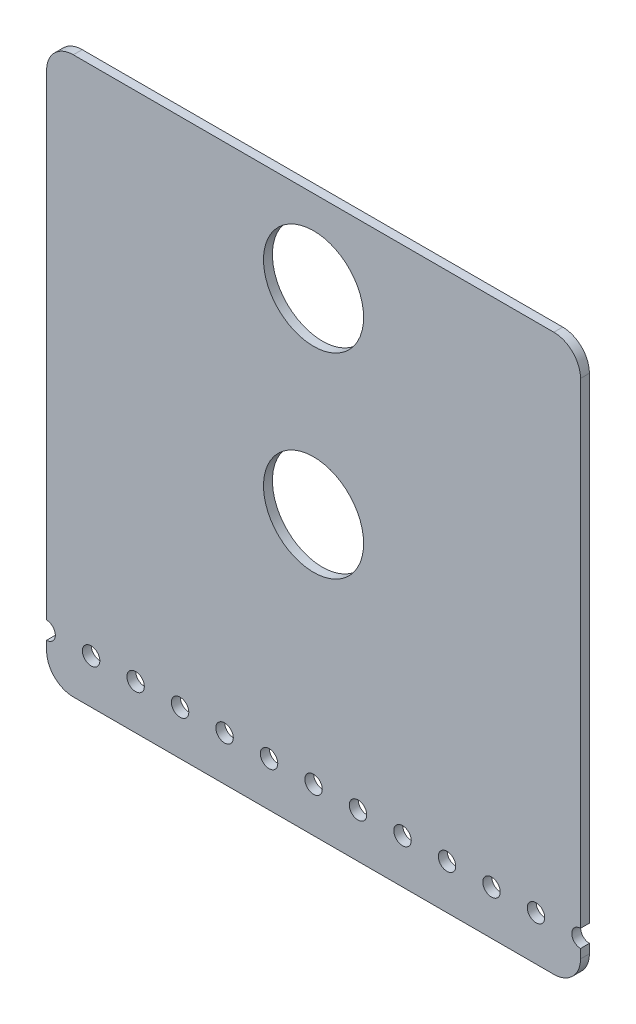
ISO-10303-21;
HEADER;
FILE_DESCRIPTION(('STEP AP214'),'2;1');
FILE_NAME('part.step','',(''),(''),'','','');
FILE_SCHEMA(('AUTOMOTIVE_DESIGN { 1 0 10303 214 1 1 1 1 }'));
ENDSEC;
DATA;
#1=APPLICATION_CONTEXT('core data for automotive mechanical design processes');
#2=APPLICATION_PROTOCOL_DEFINITION('international standard','automotive_design',2000,#1);
#3=PRODUCT_CONTEXT('',#1,'mechanical');
#4=PRODUCT('Part','Part','',(#3));
#5=PRODUCT_RELATED_PRODUCT_CATEGORY('part','',(#4));
#6=PRODUCT_DEFINITION_FORMATION('','',#4);
#7=PRODUCT_DEFINITION_CONTEXT('part definition',#1,'design');
#8=PRODUCT_DEFINITION('design','',#6,#7);
#9=PRODUCT_DEFINITION_SHAPE('','',#8);
#10=(LENGTH_UNIT() NAMED_UNIT(*) SI_UNIT(.MILLI.,.METRE.));
#11=(NAMED_UNIT(*) PLANE_ANGLE_UNIT() SI_UNIT($,.RADIAN.));
#12=(NAMED_UNIT(*) SI_UNIT($,.STERADIAN.) SOLID_ANGLE_UNIT());
#13=UNCERTAINTY_MEASURE_WITH_UNIT(LENGTH_MEASURE(1.E-05),#10,'distance_accuracy_value','');
#14=(GEOMETRIC_REPRESENTATION_CONTEXT(3) GLOBAL_UNCERTAINTY_ASSIGNED_CONTEXT((#13)) GLOBAL_UNIT_ASSIGNED_CONTEXT((#10,
#11,#12)) REPRESENTATION_CONTEXT('',''));
#15=CARTESIAN_POINT('',(0.,0.,0.));
#16=DIRECTION('',(0.,0.,1.));
#17=DIRECTION('',(1.,0.,0.));
#18=AXIS2_PLACEMENT_3D('',#15,#16,#17);
#19=CARTESIAN_POINT('',(76.1999999999999,0.,2.54));
#20=DIRECTION('',(1.,0.,0.));
#21=DIRECTION('',(0.,0.,-1.));
#22=AXIS2_PLACEMENT_3D('',#19,#20,#21);
#23=PLANE('',#22);
#24=DIRECTION('',(0.,-1.,0.));
#25=VECTOR('',#24,1.);
#26=CARTESIAN_POINT('',(76.1999999999999,0.,0.));
#27=LINE('',#26,#25);
#28=CARTESIAN_POINT('',(76.1999999999999,125.73,0.));
#29=VERTEX_POINT('',#28);
#30=CARTESIAN_POINT('',(76.1999999999999,-10.2107999999998,0.));
#31=VERTEX_POINT('',#30);
#32=EDGE_CURVE('E199',#29,#31,#27,.T.);
#33=ORIENTED_EDGE('',*,*,#32,.F.);
#34=DIRECTION('',(0.,0.,-1.));
#35=VECTOR('',#34,1.);
#36=CARTESIAN_POINT('',(76.1999999999999,125.73,2.54));
#37=LINE('',#36,#35);
#38=CARTESIAN_POINT('',(76.1999999999999,125.73,2.54));
#39=VERTEX_POINT('',#38);
#40=EDGE_CURVE('E43',#29,#39,#37,.F.);
#41=ORIENTED_EDGE('',*,*,#40,.T.);
#42=DIRECTION('',(0.,-1.,0.));
#43=VECTOR('',#42,1.);
#44=CARTESIAN_POINT('',(76.1999999999999,0.,2.54));
#45=LINE('',#44,#43);
#46=CARTESIAN_POINT('',(76.1999999999999,-10.2107999999998,2.54));
#47=VERTEX_POINT('',#46);
#48=EDGE_CURVE('E288',#39,#47,#45,.T.);
#49=ORIENTED_EDGE('',*,*,#48,.T.);
#50=DIRECTION('',(0.,0.,-1.));
#51=VECTOR('',#50,1.);
#52=CARTESIAN_POINT('',(76.1999999999999,-10.2107999999998,2.54));
#53=LINE('',#52,#51);
#54=EDGE_CURVE('E195',#47,#31,#53,.T.);
#55=ORIENTED_EDGE('',*,*,#54,.T.);
#56=EDGE_LOOP('',(#33,#41,#49,#55));
#57=FACE_BOUND('',#56,.T.);
#58=ADVANCED_FACE('F35',(#57),#23,.T.);
#59=CARTESIAN_POINT('',(0.,133.35,2.54));
#60=DIRECTION('',(0.,1.,0.));
#61=DIRECTION('',(0.,0.,1.));
#62=AXIS2_PLACEMENT_3D('',#59,#60,#61);
#63=PLANE('',#62);
#64=DIRECTION('',(1.,0.,0.));
#65=VECTOR('',#64,1.);
#66=CARTESIAN_POINT('',(0.,133.35,2.54));
#67=LINE('',#66,#65);
#68=CARTESIAN_POINT('',(-68.58,133.35,2.54));
#69=VERTEX_POINT('',#68);
#70=CARTESIAN_POINT('',(68.5799999999999,133.35,2.54));
#71=VERTEX_POINT('',#70);
#72=EDGE_CURVE('E134',#69,#71,#67,.T.);
#73=ORIENTED_EDGE('',*,*,#72,.T.);
#74=DIRECTION('',(0.,0.,-1.));
#75=VECTOR('',#74,1.);
#76=CARTESIAN_POINT('',(68.5799999999999,133.35,2.54));
#77=LINE('',#76,#75);
#78=CARTESIAN_POINT('',(68.5799999999999,133.35,0.));
#79=VERTEX_POINT('',#78);
#80=EDGE_CURVE('E282',#71,#79,#77,.T.);
#81=ORIENTED_EDGE('',*,*,#80,.T.);
#82=DIRECTION('',(1.,0.,0.));
#83=VECTOR('',#82,1.);
#84=CARTESIAN_POINT('',(0.,133.35,0.));
#85=LINE('',#84,#83);
#86=CARTESIAN_POINT('',(-68.58,133.35,0.));
#87=VERTEX_POINT('',#86);
#88=EDGE_CURVE('E201',#87,#79,#85,.T.);
#89=ORIENTED_EDGE('',*,*,#88,.F.);
#90=DIRECTION('',(0.,0.,-1.));
#91=VECTOR('',#90,1.);
#92=CARTESIAN_POINT('',(-68.58,133.35,2.54));
#93=LINE('',#92,#91);
#94=EDGE_CURVE('E280',#87,#69,#93,.F.);
#95=ORIENTED_EDGE('',*,*,#94,.T.);
#96=EDGE_LOOP('',(#73,#81,#89,#95));
#97=FACE_BOUND('',#96,.T.);
#98=ADVANCED_FACE('F300',(#97),#63,.T.);
#99=CARTESIAN_POINT('',(-76.1999999999999,0.,2.54));
#100=DIRECTION('',(1.,0.,0.));
#101=DIRECTION('',(0.,1.,0.));
#102=AXIS2_PLACEMENT_3D('',#99,#100,#101);
#103=PLANE('',#102);
#104=DIRECTION('',(0.,-1.,0.));
#105=VECTOR('',#104,1.);
#106=CARTESIAN_POINT('',(-76.1999999999999,0.,2.54));
#107=LINE('',#106,#105);
#108=CARTESIAN_POINT('',(-76.2,125.73,2.54));
#109=VERTEX_POINT('',#108);
#110=CARTESIAN_POINT('',(-76.1999999999999,-10.2107999999998,2.54));
#111=VERTEX_POINT('',#110);
#112=EDGE_CURVE('E125',#109,#111,#107,.T.);
#113=ORIENTED_EDGE('',*,*,#112,.F.);
#114=DIRECTION('',(0.,0.,-1.));
#115=VECTOR('',#114,1.);
#116=CARTESIAN_POINT('',(-76.2,125.73,0.));
#117=LINE('',#116,#115);
#118=CARTESIAN_POINT('',(-76.2,125.73,0.));
#119=VERTEX_POINT('',#118);
#120=EDGE_CURVE('E11',#109,#119,#117,.T.);
#121=ORIENTED_EDGE('',*,*,#120,.T.);
#122=DIRECTION('',(0.,-1.,0.));
#123=VECTOR('',#122,1.);
#124=CARTESIAN_POINT('',(-76.1999999999999,0.,0.));
#125=LINE('',#124,#123);
#126=CARTESIAN_POINT('',(-76.1999999999999,-10.2107999999998,0.));
#127=VERTEX_POINT('',#126);
#128=EDGE_CURVE('E141',#119,#127,#125,.T.);
#129=ORIENTED_EDGE('',*,*,#128,.T.);
#130=DIRECTION('',(0.,0.,-1.));
#131=VECTOR('',#130,1.);
#132=CARTESIAN_POINT('',(-76.1999999999999,-10.2107999999998,2.54));
#133=LINE('',#132,#131);
#134=EDGE_CURVE('E138',#111,#127,#133,.T.);
#135=ORIENTED_EDGE('',*,*,#134,.F.);
#136=EDGE_LOOP('',(#113,#121,#129,#135));
#137=FACE_BOUND('',#136,.T.);
#138=ADVANCED_FACE('F139',(#137),#103,.F.);
#139=CARTESIAN_POINT('',(-76.1999999999999,-12.6999999999999,2.54));
#140=DIRECTION('',(0.,0.,-1.));
#141=DIRECTION('',(-1.,0.,0.));
#142=AXIS2_PLACEMENT_3D('',#139,#140,#141);
#143=CYLINDRICAL_SURFACE('',#142,2.48920000000006);
#144=CARTESIAN_POINT('',(-76.1999999999999,-12.6999999999999,0.));
#145=DIRECTION('',(0.,0.,1.));
#146=DIRECTION('',(1.,0.,0.));
#147=AXIS2_PLACEMENT_3D('',#144,#145,#146);
#148=CIRCLE('',#147,2.48920000000006);
#149=CARTESIAN_POINT('',(-76.1999999999999,-15.1891999999999,0.));
#150=VERTEX_POINT('',#149);
#151=EDGE_CURVE('E206',#150,#127,#148,.T.);
#152=ORIENTED_EDGE('',*,*,#151,.F.);
#153=DIRECTION('',(0.,0.,-1.));
#154=VECTOR('',#153,1.);
#155=CARTESIAN_POINT('',(-76.1999999999999,-15.1891999999999,2.54));
#156=LINE('',#155,#154);
#157=CARTESIAN_POINT('',(-76.1999999999999,-15.1891999999999,2.54));
#158=VERTEX_POINT('',#157);
#159=EDGE_CURVE('E146',#158,#150,#156,.T.);
#160=ORIENTED_EDGE('',*,*,#159,.F.);
#161=CARTESIAN_POINT('',(-76.1999999999999,-12.6999999999999,2.54));
#162=DIRECTION('',(0.,0.,1.));
#163=DIRECTION('',(1.,0.,0.));
#164=AXIS2_PLACEMENT_3D('',#161,#162,#163);
#165=CIRCLE('',#164,2.48920000000006);
#166=EDGE_CURVE('E131',#158,#111,#165,.T.);
#167=ORIENTED_EDGE('',*,*,#166,.T.);
#168=ORIENTED_EDGE('',*,*,#134,.T.);
#169=EDGE_LOOP('',(#152,#160,#167,#168));
#170=FACE_BOUND('',#169,.T.);
#171=ADVANCED_FACE('F148',(#170),#143,.F.);
#172=CARTESIAN_POINT('',(-76.1999999999999,-17.78,0.));
#173=VERTEX_POINT('',#172);
#174=EDGE_CURVE('E207',#150,#173,#125,.T.);
#175=ORIENTED_EDGE('',*,*,#174,.T.);
#176=DIRECTION('',(0.,0.,-1.));
#177=VECTOR('',#176,1.);
#178=CARTESIAN_POINT('',(-76.1999999999999,-17.78,2.54));
#179=LINE('',#178,#177);
#180=CARTESIAN_POINT('',(-76.1999999999999,-17.78,2.54));
#181=VERTEX_POINT('',#180);
#182=EDGE_CURVE('E50',#173,#181,#179,.F.);
#183=ORIENTED_EDGE('',*,*,#182,.T.);
#184=EDGE_CURVE('E136',#158,#181,#107,.T.);
#185=ORIENTED_EDGE('',*,*,#184,.F.);
#186=ORIENTED_EDGE('',*,*,#159,.T.);
#187=EDGE_LOOP('',(#175,#183,#185,#186));
#188=FACE_BOUND('',#187,.T.);
#189=ADVANCED_FACE('F346',(#188),#103,.F.);
#190=CARTESIAN_POINT('',(0.,-25.4,2.54));
#191=DIRECTION('',(0.,-1.,0.));
#192=DIRECTION('',(1.,0.,0.));
#193=AXIS2_PLACEMENT_3D('',#190,#191,#192);
#194=PLANE('',#193);
#195=DIRECTION('',(-1.,0.,0.));
#196=VECTOR('',#195,1.);
#197=CARTESIAN_POINT('',(0.,-25.4,0.));
#198=LINE('',#197,#196);
#199=CARTESIAN_POINT('',(68.5799999999999,-25.3999999999999,0.));
#200=VERTEX_POINT('',#199);
#201=CARTESIAN_POINT('',(-68.5799999999999,-25.4,0.));
#202=VERTEX_POINT('',#201);
#203=EDGE_CURVE('E209',#200,#202,#198,.T.);
#204=ORIENTED_EDGE('',*,*,#203,.F.);
#205=DIRECTION('',(0.,0.,-1.));
#206=VECTOR('',#205,1.);
#207=CARTESIAN_POINT('',(68.5799999999999,-25.3999999999999,2.54));
#208=LINE('',#207,#206);
#209=CARTESIAN_POINT('',(68.5799999999999,-25.3999999999999,2.54));
#210=VERTEX_POINT('',#209);
#211=EDGE_CURVE('E270',#200,#210,#208,.F.);
#212=ORIENTED_EDGE('',*,*,#211,.T.);
#213=DIRECTION('',(-1.,0.,0.));
#214=VECTOR('',#213,1.);
#215=CARTESIAN_POINT('',(0.,-25.4,2.54));
#216=LINE('',#215,#214);
#217=CARTESIAN_POINT('',(-68.5799999999999,-25.4,2.54));
#218=VERTEX_POINT('',#217);
#219=EDGE_CURVE('E150',#210,#218,#216,.T.);
#220=ORIENTED_EDGE('',*,*,#219,.T.);
#221=DIRECTION('',(0.,0.,-1.));
#222=VECTOR('',#221,1.);
#223=CARTESIAN_POINT('',(-68.5799999999999,-25.4,0.));
#224=LINE('',#223,#222);
#225=EDGE_CURVE('E267',#218,#202,#224,.T.);
#226=ORIENTED_EDGE('',*,*,#225,.T.);
#227=EDGE_LOOP('',(#204,#212,#220,#226));
#228=FACE_BOUND('',#227,.T.);
#229=ADVANCED_FACE('F337',(#228),#194,.T.);
#230=CARTESIAN_POINT('',(76.1999999999999,-15.1891999999998,2.54));
#231=VERTEX_POINT('',#230);
#232=CARTESIAN_POINT('',(76.1999999999999,-17.7799999999999,2.54));
#233=VERTEX_POINT('',#232);
#234=EDGE_CURVE('E155',#231,#233,#45,.T.);
#235=ORIENTED_EDGE('',*,*,#234,.T.);
#236=DIRECTION('',(0.,0.,-1.));
#237=VECTOR('',#236,1.);
#238=CARTESIAN_POINT('',(76.1999999999999,-17.7799999999999,2.54));
#239=LINE('',#238,#237);
#240=CARTESIAN_POINT('',(76.1999999999999,-17.7799999999999,0.));
#241=VERTEX_POINT('',#240);
#242=EDGE_CURVE('E145',#233,#241,#239,.T.);
#243=ORIENTED_EDGE('',*,*,#242,.T.);
#244=CARTESIAN_POINT('',(76.1999999999999,-15.1891999999998,0.));
#245=VERTEX_POINT('',#244);
#246=EDGE_CURVE('E202',#245,#241,#27,.T.);
#247=ORIENTED_EDGE('',*,*,#246,.F.);
#248=DIRECTION('',(0.,0.,-1.));
#249=VECTOR('',#248,1.);
#250=CARTESIAN_POINT('',(76.1999999999999,-15.1891999999998,2.54));
#251=LINE('',#250,#249);
#252=EDGE_CURVE('E254',#231,#245,#251,.T.);
#253=ORIENTED_EDGE('',*,*,#252,.F.);
#254=EDGE_LOOP('',(#235,#243,#247,#253));
#255=FACE_BOUND('',#254,.T.);
#256=ADVANCED_FACE('F328',(#255),#23,.T.);
#257=CARTESIAN_POINT('',(63.4999999999999,-12.6999999999998,2.54));
#258=DIRECTION('',(0.,0.,-1.));
#259=DIRECTION('',(-1.,0.,0.));
#260=AXIS2_PLACEMENT_3D('',#257,#258,#259);
#261=CYLINDRICAL_SURFACE('',#260,2.48919999999995);
#262=CARTESIAN_POINT('',(63.4999999999999,-12.6999999999998,2.54));
#263=DIRECTION('',(0.,0.,1.));
#264=DIRECTION('',(1.,0.,0.));
#265=AXIS2_PLACEMENT_3D('',#262,#263,#264);
#266=CIRCLE('',#265,2.48919999999995);
#267=CARTESIAN_POINT('',(65.9891999999999,-12.6999999999998,2.54));
#268=VERTEX_POINT('',#267);
#269=EDGE_CURVE('E189',#268,#268,#266,.T.);
#270=ORIENTED_EDGE('',*,*,#269,.T.);
#271=EDGE_LOOP('',(#270));
#272=FACE_BOUND('',#271,.T.);
#273=CARTESIAN_POINT('',(63.4999999999999,-12.6999999999998,0.));
#274=DIRECTION('',(0.,0.,1.));
#275=DIRECTION('',(1.,0.,0.));
#276=AXIS2_PLACEMENT_3D('',#273,#274,#275);
#277=CIRCLE('',#276,2.48919999999995);
#278=CARTESIAN_POINT('',(65.9891999999999,-12.6999999999998,0.));
#279=VERTEX_POINT('',#278);
#280=EDGE_CURVE('E245',#279,#279,#277,.T.);
#281=ORIENTED_EDGE('',*,*,#280,.F.);
#282=EDGE_LOOP('',(#281));
#283=FACE_BOUND('',#282,.T.);
#284=ADVANCED_FACE('F336',(#272,#283),#261,.F.);
#285=CARTESIAN_POINT('',(50.7999999999999,-12.6999999999998,2.54));
#286=DIRECTION('',(0.,0.,-1.));
#287=DIRECTION('',(-1.,0.,0.));
#288=AXIS2_PLACEMENT_3D('',#285,#286,#287);
#289=CYLINDRICAL_SURFACE('',#288,2.4892);
#290=CARTESIAN_POINT('',(50.7999999999999,-12.6999999999998,2.54));
#291=DIRECTION('',(0.,0.,1.));
#292=DIRECTION('',(1.,0.,0.));
#293=AXIS2_PLACEMENT_3D('',#290,#291,#292);
#294=CIRCLE('',#293,2.4892);
#295=CARTESIAN_POINT('',(53.2891999999999,-12.6999999999998,2.54));
#296=VERTEX_POINT('',#295);
#297=EDGE_CURVE('E186',#296,#296,#294,.T.);
#298=ORIENTED_EDGE('',*,*,#297,.T.);
#299=EDGE_LOOP('',(#298));
#300=FACE_BOUND('',#299,.T.);
#301=CARTESIAN_POINT('',(50.7999999999999,-12.6999999999998,0.));
#302=DIRECTION('',(0.,0.,1.));
#303=DIRECTION('',(1.,0.,0.));
#304=AXIS2_PLACEMENT_3D('',#301,#302,#303);
#305=CIRCLE('',#304,2.4892);
#306=CARTESIAN_POINT('',(53.2891999999999,-12.6999999999998,0.));
#307=VERTEX_POINT('',#306);
#308=EDGE_CURVE('E242',#307,#307,#305,.T.);
#309=ORIENTED_EDGE('',*,*,#308,.F.);
#310=EDGE_LOOP('',(#309));
#311=FACE_BOUND('',#310,.T.);
#312=ADVANCED_FACE('F343',(#300,#311),#289,.F.);
#313=CARTESIAN_POINT('',(38.1,-12.6999999999998,2.54));
#314=DIRECTION('',(0.,0.,-1.));
#315=DIRECTION('',(-1.,0.,0.));
#316=AXIS2_PLACEMENT_3D('',#313,#314,#315);
#317=CYLINDRICAL_SURFACE('',#316,2.4892);
#318=CARTESIAN_POINT('',(38.1,-12.6999999999998,2.54));
#319=DIRECTION('',(0.,0.,1.));
#320=DIRECTION('',(1.,0.,0.));
#321=AXIS2_PLACEMENT_3D('',#318,#319,#320);
#322=CIRCLE('',#321,2.4892);
#323=CARTESIAN_POINT('',(40.5892,-12.6999999999998,2.54));
#324=VERTEX_POINT('',#323);
#325=EDGE_CURVE('E183',#324,#324,#322,.T.);
#326=ORIENTED_EDGE('',*,*,#325,.T.);
#327=EDGE_LOOP('',(#326));
#328=FACE_BOUND('',#327,.T.);
#329=CARTESIAN_POINT('',(38.1,-12.6999999999998,0.));
#330=DIRECTION('',(0.,0.,1.));
#331=DIRECTION('',(1.,0.,0.));
#332=AXIS2_PLACEMENT_3D('',#329,#330,#331);
#333=CIRCLE('',#332,2.4892);
#334=CARTESIAN_POINT('',(40.5892,-12.6999999999998,0.));
#335=VERTEX_POINT('',#334);
#336=EDGE_CURVE('E239',#335,#335,#333,.T.);
#337=ORIENTED_EDGE('',*,*,#336,.F.);
#338=EDGE_LOOP('',(#337));
#339=FACE_BOUND('',#338,.T.);
#340=ADVANCED_FACE('F392',(#328,#339),#317,.F.);
#341=CARTESIAN_POINT('',(25.4,-12.6999999999998,2.54));
#342=DIRECTION('',(0.,0.,-1.));
#343=DIRECTION('',(-1.,0.,0.));
#344=AXIS2_PLACEMENT_3D('',#341,#342,#343);
#345=CYLINDRICAL_SURFACE('',#344,2.4892);
#346=CARTESIAN_POINT('',(25.4,-12.6999999999998,2.54));
#347=DIRECTION('',(0.,0.,1.));
#348=DIRECTION('',(1.,0.,0.));
#349=AXIS2_PLACEMENT_3D('',#346,#347,#348);
#350=CIRCLE('',#349,2.4892);
#351=CARTESIAN_POINT('',(27.8892,-12.6999999999998,2.54));
#352=VERTEX_POINT('',#351);
#353=EDGE_CURVE('E180',#352,#352,#350,.T.);
#354=ORIENTED_EDGE('',*,*,#353,.T.);
#355=EDGE_LOOP('',(#354));
#356=FACE_BOUND('',#355,.T.);
#357=CARTESIAN_POINT('',(25.4,-12.6999999999998,0.));
#358=DIRECTION('',(0.,0.,1.));
#359=DIRECTION('',(1.,0.,0.));
#360=AXIS2_PLACEMENT_3D('',#357,#358,#359);
#361=CIRCLE('',#360,2.4892);
#362=CARTESIAN_POINT('',(27.8892,-12.6999999999998,0.));
#363=VERTEX_POINT('',#362);
#364=EDGE_CURVE('E236',#363,#363,#361,.T.);
#365=ORIENTED_EDGE('',*,*,#364,.F.);
#366=EDGE_LOOP('',(#365));
#367=FACE_BOUND('',#366,.T.);
#368=ADVANCED_FACE('F402',(#356,#367),#345,.F.);
#369=CARTESIAN_POINT('',(12.7,-12.6999999999998,2.54));
#370=DIRECTION('',(0.,0.,-1.));
#371=DIRECTION('',(-1.,0.,0.));
#372=AXIS2_PLACEMENT_3D('',#369,#370,#371);
#373=CYLINDRICAL_SURFACE('',#372,2.4892);
#374=CARTESIAN_POINT('',(12.7,-12.6999999999998,2.54));
#375=DIRECTION('',(0.,0.,1.));
#376=DIRECTION('',(1.,0.,0.));
#377=AXIS2_PLACEMENT_3D('',#374,#375,#376);
#378=CIRCLE('',#377,2.4892);
#379=CARTESIAN_POINT('',(15.1892,-12.6999999999998,2.54));
#380=VERTEX_POINT('',#379);
#381=EDGE_CURVE('E177',#380,#380,#378,.T.);
#382=ORIENTED_EDGE('',*,*,#381,.T.);
#383=EDGE_LOOP('',(#382));
#384=FACE_BOUND('',#383,.T.);
#385=CARTESIAN_POINT('',(12.7,-12.6999999999998,0.));
#386=DIRECTION('',(0.,0.,1.));
#387=DIRECTION('',(1.,0.,0.));
#388=AXIS2_PLACEMENT_3D('',#385,#386,#387);
#389=CIRCLE('',#388,2.4892);
#390=CARTESIAN_POINT('',(15.1892,-12.6999999999998,0.));
#391=VERTEX_POINT('',#390);
#392=EDGE_CURVE('E233',#391,#391,#389,.T.);
#393=ORIENTED_EDGE('',*,*,#392,.F.);
#394=EDGE_LOOP('',(#393));
#395=FACE_BOUND('',#394,.T.);
#396=ADVANCED_FACE('F412',(#384,#395),#373,.F.);
#397=CARTESIAN_POINT('',(0.,-12.6999999999998,2.54));
#398=DIRECTION('',(0.,0.,-1.));
#399=DIRECTION('',(-1.,0.,0.));
#400=AXIS2_PLACEMENT_3D('',#397,#398,#399);
#401=CYLINDRICAL_SURFACE('',#400,2.48919999999995);
#402=CARTESIAN_POINT('',(0.,-12.6999999999998,2.54));
#403=DIRECTION('',(0.,0.,1.));
#404=DIRECTION('',(1.,0.,0.));
#405=AXIS2_PLACEMENT_3D('',#402,#403,#404);
#406=CIRCLE('',#405,2.48919999999995);
#407=CARTESIAN_POINT('',(2.48919999999994,-12.6999999999998,2.54));
#408=VERTEX_POINT('',#407);
#409=EDGE_CURVE('E174',#408,#408,#406,.T.);
#410=ORIENTED_EDGE('',*,*,#409,.T.);
#411=EDGE_LOOP('',(#410));
#412=FACE_BOUND('',#411,.T.);
#413=CARTESIAN_POINT('',(0.,-12.6999999999998,0.));
#414=DIRECTION('',(0.,0.,1.));
#415=DIRECTION('',(1.,0.,0.));
#416=AXIS2_PLACEMENT_3D('',#413,#414,#415);
#417=CIRCLE('',#416,2.48919999999995);
#418=CARTESIAN_POINT('',(2.48919999999994,-12.6999999999998,0.));
#419=VERTEX_POINT('',#418);
#420=EDGE_CURVE('E230',#419,#419,#417,.T.);
#421=ORIENTED_EDGE('',*,*,#420,.F.);
#422=EDGE_LOOP('',(#421));
#423=FACE_BOUND('',#422,.T.);
#424=ADVANCED_FACE('F422',(#412,#423),#401,.F.);
#425=CARTESIAN_POINT('',(-12.7,-12.6999999999998,2.54));
#426=DIRECTION('',(0.,0.,-1.));
#427=DIRECTION('',(-1.,0.,0.));
#428=AXIS2_PLACEMENT_3D('',#425,#426,#427);
#429=CYLINDRICAL_SURFACE('',#428,2.4892);
#430=CARTESIAN_POINT('',(-12.7,-12.6999999999998,2.54));
#431=DIRECTION('',(0.,0.,1.));
#432=DIRECTION('',(1.,0.,0.));
#433=AXIS2_PLACEMENT_3D('',#430,#431,#432);
#434=CIRCLE('',#433,2.4892);
#435=CARTESIAN_POINT('',(-10.2108,-12.6999999999998,2.54));
#436=VERTEX_POINT('',#435);
#437=EDGE_CURVE('E171',#436,#436,#434,.T.);
#438=ORIENTED_EDGE('',*,*,#437,.T.);
#439=EDGE_LOOP('',(#438));
#440=FACE_BOUND('',#439,.T.);
#441=CARTESIAN_POINT('',(-12.7,-12.6999999999998,0.));
#442=DIRECTION('',(0.,0.,1.));
#443=DIRECTION('',(1.,0.,0.));
#444=AXIS2_PLACEMENT_3D('',#441,#442,#443);
#445=CIRCLE('',#444,2.4892);
#446=CARTESIAN_POINT('',(-10.2108,-12.6999999999998,0.));
#447=VERTEX_POINT('',#446);
#448=EDGE_CURVE('E227',#447,#447,#445,.T.);
#449=ORIENTED_EDGE('',*,*,#448,.F.);
#450=EDGE_LOOP('',(#449));
#451=FACE_BOUND('',#450,.T.);
#452=ADVANCED_FACE('F432',(#440,#451),#429,.F.);
#453=CARTESIAN_POINT('',(-25.4,-12.6999999999998,2.54));
#454=DIRECTION('',(0.,0.,-1.));
#455=DIRECTION('',(-1.,0.,0.));
#456=AXIS2_PLACEMENT_3D('',#453,#454,#455);
#457=CYLINDRICAL_SURFACE('',#456,2.4892);
#458=CARTESIAN_POINT('',(-25.4,-12.6999999999998,2.54));
#459=DIRECTION('',(0.,0.,1.));
#460=DIRECTION('',(1.,0.,0.));
#461=AXIS2_PLACEMENT_3D('',#458,#459,#460);
#462=CIRCLE('',#461,2.4892);
#463=CARTESIAN_POINT('',(-22.9108,-12.6999999999998,2.54));
#464=VERTEX_POINT('',#463);
#465=EDGE_CURVE('E168',#464,#464,#462,.T.);
#466=ORIENTED_EDGE('',*,*,#465,.T.);
#467=EDGE_LOOP('',(#466));
#468=FACE_BOUND('',#467,.T.);
#469=CARTESIAN_POINT('',(-25.4,-12.6999999999998,0.));
#470=DIRECTION('',(0.,0.,1.));
#471=DIRECTION('',(1.,0.,0.));
#472=AXIS2_PLACEMENT_3D('',#469,#470,#471);
#473=CIRCLE('',#472,2.4892);
#474=CARTESIAN_POINT('',(-22.9108,-12.6999999999998,0.));
#475=VERTEX_POINT('',#474);
#476=EDGE_CURVE('E224',#475,#475,#473,.T.);
#477=ORIENTED_EDGE('',*,*,#476,.F.);
#478=EDGE_LOOP('',(#477));
#479=FACE_BOUND('',#478,.T.);
#480=ADVANCED_FACE('F442',(#468,#479),#457,.F.);
#481=CARTESIAN_POINT('',(-38.1,-12.6999999999998,2.54));
#482=DIRECTION('',(0.,0.,-1.));
#483=DIRECTION('',(-1.,0.,0.));
#484=AXIS2_PLACEMENT_3D('',#481,#482,#483);
#485=CYLINDRICAL_SURFACE('',#484,2.4892);
#486=CARTESIAN_POINT('',(-38.1,-12.6999999999998,2.54));
#487=DIRECTION('',(0.,0.,1.));
#488=DIRECTION('',(1.,0.,0.));
#489=AXIS2_PLACEMENT_3D('',#486,#487,#488);
#490=CIRCLE('',#489,2.4892);
#491=CARTESIAN_POINT('',(-35.6108,-12.6999999999998,2.54));
#492=VERTEX_POINT('',#491);
#493=EDGE_CURVE('E165',#492,#492,#490,.T.);
#494=ORIENTED_EDGE('',*,*,#493,.T.);
#495=EDGE_LOOP('',(#494));
#496=FACE_BOUND('',#495,.T.);
#497=CARTESIAN_POINT('',(-38.1,-12.6999999999998,0.));
#498=DIRECTION('',(0.,0.,1.));
#499=DIRECTION('',(1.,0.,0.));
#500=AXIS2_PLACEMENT_3D('',#497,#498,#499);
#501=CIRCLE('',#500,2.4892);
#502=CARTESIAN_POINT('',(-35.6108,-12.6999999999998,0.));
#503=VERTEX_POINT('',#502);
#504=EDGE_CURVE('E221',#503,#503,#501,.T.);
#505=ORIENTED_EDGE('',*,*,#504,.F.);
#506=EDGE_LOOP('',(#505));
#507=FACE_BOUND('',#506,.T.);
#508=ADVANCED_FACE('F452',(#496,#507),#485,.F.);
#509=CARTESIAN_POINT('',(-50.8,-12.6999999999998,2.54));
#510=DIRECTION('',(0.,0.,-1.));
#511=DIRECTION('',(-1.,0.,0.));
#512=AXIS2_PLACEMENT_3D('',#509,#510,#511);
#513=CYLINDRICAL_SURFACE('',#512,2.4892);
#514=CARTESIAN_POINT('',(-50.8,-12.6999999999998,2.54));
#515=DIRECTION('',(0.,0.,1.));
#516=DIRECTION('',(1.,0.,0.));
#517=AXIS2_PLACEMENT_3D('',#514,#515,#516);
#518=CIRCLE('',#517,2.4892);
#519=CARTESIAN_POINT('',(-48.3108,-12.6999999999998,2.54));
#520=VERTEX_POINT('',#519);
#521=EDGE_CURVE('E162',#520,#520,#518,.T.);
#522=ORIENTED_EDGE('',*,*,#521,.T.);
#523=EDGE_LOOP('',(#522));
#524=FACE_BOUND('',#523,.T.);
#525=CARTESIAN_POINT('',(-50.8,-12.6999999999998,0.));
#526=DIRECTION('',(0.,0.,1.));
#527=DIRECTION('',(1.,0.,0.));
#528=AXIS2_PLACEMENT_3D('',#525,#526,#527);
#529=CIRCLE('',#528,2.4892);
#530=CARTESIAN_POINT('',(-48.3108,-12.6999999999998,0.));
#531=VERTEX_POINT('',#530);
#532=EDGE_CURVE('E218',#531,#531,#529,.T.);
#533=ORIENTED_EDGE('',*,*,#532,.F.);
#534=EDGE_LOOP('',(#533));
#535=FACE_BOUND('',#534,.T.);
#536=ADVANCED_FACE('F462',(#524,#535),#513,.F.);
#537=CARTESIAN_POINT('',(-63.5,-12.6999999999998,2.54));
#538=DIRECTION('',(0.,0.,-1.));
#539=DIRECTION('',(-1.,0.,0.));
#540=AXIS2_PLACEMENT_3D('',#537,#538,#539);
#541=CYLINDRICAL_SURFACE('',#540,2.48919999999995);
#542=CARTESIAN_POINT('',(-63.5,-12.6999999999998,2.54));
#543=DIRECTION('',(0.,0.,1.));
#544=DIRECTION('',(1.,0.,0.));
#545=AXIS2_PLACEMENT_3D('',#542,#543,#544);
#546=CIRCLE('',#545,2.48919999999995);
#547=CARTESIAN_POINT('',(-61.0108,-12.6999999999998,2.54));
#548=VERTEX_POINT('',#547);
#549=EDGE_CURVE('E159',#548,#548,#546,.T.);
#550=ORIENTED_EDGE('',*,*,#549,.T.);
#551=EDGE_LOOP('',(#550));
#552=FACE_BOUND('',#551,.T.);
#553=CARTESIAN_POINT('',(-63.5,-12.6999999999998,0.));
#554=DIRECTION('',(0.,0.,1.));
#555=DIRECTION('',(1.,0.,0.));
#556=AXIS2_PLACEMENT_3D('',#553,#554,#555);
#557=CIRCLE('',#556,2.48919999999995);
#558=CARTESIAN_POINT('',(-61.0108,-12.6999999999998,0.));
#559=VERTEX_POINT('',#558);
#560=EDGE_CURVE('E215',#559,#559,#557,.T.);
#561=ORIENTED_EDGE('',*,*,#560,.F.);
#562=EDGE_LOOP('',(#561));
#563=FACE_BOUND('',#562,.T.);
#564=ADVANCED_FACE('F472',(#552,#563),#541,.F.);
#565=CARTESIAN_POINT('',(76.1999999999999,-12.6999999999998,2.54));
#566=DIRECTION('',(0.,0.,-1.));
#567=DIRECTION('',(-1.,0.,0.));
#568=AXIS2_PLACEMENT_3D('',#565,#566,#567);
#569=CYLINDRICAL_SURFACE('',#568,2.48920000000002);
#570=CARTESIAN_POINT('',(76.1999999999999,-12.6999999999998,0.));
#571=DIRECTION('',(0.,0.,1.));
#572=DIRECTION('',(1.,0.,0.));
#573=AXIS2_PLACEMENT_3D('',#570,#571,#572);
#574=CIRCLE('',#573,2.48920000000002);
#575=EDGE_CURVE('E212',#31,#245,#574,.T.);
#576=ORIENTED_EDGE('',*,*,#575,.F.);
#577=ORIENTED_EDGE('',*,*,#54,.F.);
#578=CARTESIAN_POINT('',(76.1999999999999,-12.6999999999998,2.54));
#579=DIRECTION('',(0.,0.,1.));
#580=DIRECTION('',(1.,0.,0.));
#581=AXIS2_PLACEMENT_3D('',#578,#579,#580);
#582=CIRCLE('',#581,2.48920000000002);
#583=EDGE_CURVE('E156',#47,#231,#582,.T.);
#584=ORIENTED_EDGE('',*,*,#583,.T.);
#585=ORIENTED_EDGE('',*,*,#252,.T.);
#586=EDGE_LOOP('',(#576,#577,#584,#585));
#587=FACE_BOUND('',#586,.T.);
#588=ADVANCED_FACE('F482',(#587),#569,.F.);
#589=CARTESIAN_POINT('',(0.,53.975,2.54));
#590=DIRECTION('',(0.,0.,-1.));
#591=DIRECTION('',(-1.,0.,0.));
#592=AXIS2_PLACEMENT_3D('',#589,#590,#591);
#593=CYLINDRICAL_SURFACE('',#592,14.2875);
#594=CARTESIAN_POINT('',(0.,53.975,2.54));
#595=DIRECTION('',(0.,0.,1.));
#596=DIRECTION('',(1.,0.,0.));
#597=AXIS2_PLACEMENT_3D('',#594,#595,#596);
#598=CIRCLE('',#597,14.2875);
#599=CARTESIAN_POINT('',(14.2875,53.975,2.54));
#600=VERTEX_POINT('',#599);
#601=EDGE_CURVE('E251',#600,#600,#598,.T.);
#602=ORIENTED_EDGE('',*,*,#601,.T.);
#603=EDGE_LOOP('',(#602));
#604=FACE_BOUND('',#603,.T.);
#605=CARTESIAN_POINT('',(0.,53.975,0.));
#606=DIRECTION('',(0.,0.,1.));
#607=DIRECTION('',(1.,0.,0.));
#608=AXIS2_PLACEMENT_3D('',#605,#606,#607);
#609=CIRCLE('',#608,14.2875);
#610=CARTESIAN_POINT('',(14.2875,53.975,0.));
#611=VERTEX_POINT('',#610);
#612=EDGE_CURVE('E196',#611,#611,#609,.T.);
#613=ORIENTED_EDGE('',*,*,#612,.F.);
#614=EDGE_LOOP('',(#613));
#615=FACE_BOUND('',#614,.T.);
#616=ADVANCED_FACE('F311',(#604,#615),#593,.F.);
#617=CARTESIAN_POINT('',(0.,109.855,2.54));
#618=DIRECTION('',(0.,0.,-1.));
#619=DIRECTION('',(-1.,0.,0.));
#620=AXIS2_PLACEMENT_3D('',#617,#618,#619);
#621=CYLINDRICAL_SURFACE('',#620,14.2875);
#622=CARTESIAN_POINT('',(0.,109.855,2.54));
#623=DIRECTION('',(0.,0.,1.));
#624=DIRECTION('',(1.,0.,0.));
#625=AXIS2_PLACEMENT_3D('',#622,#623,#624);
#626=CIRCLE('',#625,14.2875);
#627=CARTESIAN_POINT('',(14.2875,109.855,2.54));
#628=VERTEX_POINT('',#627);
#629=EDGE_CURVE('E192',#628,#628,#626,.T.);
#630=ORIENTED_EDGE('',*,*,#629,.T.);
#631=EDGE_LOOP('',(#630));
#632=FACE_BOUND('',#631,.T.);
#633=CARTESIAN_POINT('',(0.,109.855,0.));
#634=DIRECTION('',(0.,0.,1.));
#635=DIRECTION('',(1.,0.,0.));
#636=AXIS2_PLACEMENT_3D('',#633,#634,#635);
#637=CIRCLE('',#636,14.2875);
#638=CARTESIAN_POINT('',(14.2875,109.855,0.));
#639=VERTEX_POINT('',#638);
#640=EDGE_CURVE('E248',#639,#639,#637,.T.);
#641=ORIENTED_EDGE('',*,*,#640,.F.);
#642=EDGE_LOOP('',(#641));
#643=FACE_BOUND('',#642,.T.);
#644=ADVANCED_FACE('F315',(#632,#643),#621,.F.);
#645=CARTESIAN_POINT('',(0.,0.,2.54));
#646=DIRECTION('',(0.,0.,1.));
#647=DIRECTION('',(1.,0.,0.));
#648=AXIS2_PLACEMENT_3D('',#645,#646,#647);
#649=PLANE('',#648);
#650=ORIENTED_EDGE('',*,*,#601,.F.);
#651=EDGE_LOOP('',(#650));
#652=FACE_BOUND('',#651,.T.);
#653=ORIENTED_EDGE('',*,*,#219,.F.);
#654=CARTESIAN_POINT('',(68.5799999999999,-17.7799999999999,2.54));
#655=DIRECTION('',(0.,0.,1.));
#656=DIRECTION('',(1.,0.,0.));
#657=AXIS2_PLACEMENT_3D('',#654,#655,#656);
#658=CIRCLE('',#657,7.62);
#659=EDGE_CURVE('E277',#210,#233,#658,.T.);
#660=ORIENTED_EDGE('',*,*,#659,.T.);
#661=ORIENTED_EDGE('',*,*,#234,.F.);
#662=ORIENTED_EDGE('',*,*,#583,.F.);
#663=ORIENTED_EDGE('',*,*,#48,.F.);
#664=CARTESIAN_POINT('',(68.5799999999999,125.73,2.54));
#665=DIRECTION('',(0.,0.,1.));
#666=DIRECTION('',(1.,0.,0.));
#667=AXIS2_PLACEMENT_3D('',#664,#665,#666);
#668=CIRCLE('',#667,7.62);
#669=EDGE_CURVE('E273',#39,#71,#668,.T.);
#670=ORIENTED_EDGE('',*,*,#669,.T.);
#671=ORIENTED_EDGE('',*,*,#72,.F.);
#672=CARTESIAN_POINT('',(-68.58,125.73,2.54));
#673=DIRECTION('',(0.,0.,1.));
#674=DIRECTION('',(1.,0.,0.));
#675=AXIS2_PLACEMENT_3D('',#672,#673,#674);
#676=CIRCLE('',#675,7.62);
#677=EDGE_CURVE('E58',#69,#109,#676,.T.);
#678=ORIENTED_EDGE('',*,*,#677,.T.);
#679=ORIENTED_EDGE('',*,*,#112,.T.);
#680=ORIENTED_EDGE('',*,*,#166,.F.);
#681=ORIENTED_EDGE('',*,*,#184,.T.);
#682=CARTESIAN_POINT('',(-68.5799999999999,-17.78,2.54));
#683=DIRECTION('',(0.,0.,1.));
#684=DIRECTION('',(1.,0.,0.));
#685=AXIS2_PLACEMENT_3D('',#682,#683,#684);
#686=CIRCLE('',#685,7.62);
#687=EDGE_CURVE('E275',#181,#218,#686,.T.);
#688=ORIENTED_EDGE('',*,*,#687,.T.);
#689=EDGE_LOOP('',(#653,#660,#661,#662,#663,#670,#671,#678,#679,#680,#681,#688));
#690=FACE_BOUND('',#689,.T.);
#691=ORIENTED_EDGE('',*,*,#549,.F.);
#692=EDGE_LOOP('',(#691));
#693=FACE_BOUND('',#692,.T.);
#694=ORIENTED_EDGE('',*,*,#521,.F.);
#695=EDGE_LOOP('',(#694));
#696=FACE_BOUND('',#695,.T.);
#697=ORIENTED_EDGE('',*,*,#493,.F.);
#698=EDGE_LOOP('',(#697));
#699=FACE_BOUND('',#698,.T.);
#700=ORIENTED_EDGE('',*,*,#465,.F.);
#701=EDGE_LOOP('',(#700));
#702=FACE_BOUND('',#701,.T.);
#703=ORIENTED_EDGE('',*,*,#437,.F.);
#704=EDGE_LOOP('',(#703));
#705=FACE_BOUND('',#704,.T.);
#706=ORIENTED_EDGE('',*,*,#409,.F.);
#707=EDGE_LOOP('',(#706));
#708=FACE_BOUND('',#707,.T.);
#709=ORIENTED_EDGE('',*,*,#381,.F.);
#710=EDGE_LOOP('',(#709));
#711=FACE_BOUND('',#710,.T.);
#712=ORIENTED_EDGE('',*,*,#353,.F.);
#713=EDGE_LOOP('',(#712));
#714=FACE_BOUND('',#713,.T.);
#715=ORIENTED_EDGE('',*,*,#325,.F.);
#716=EDGE_LOOP('',(#715));
#717=FACE_BOUND('',#716,.T.);
#718=ORIENTED_EDGE('',*,*,#297,.F.);
#719=EDGE_LOOP('',(#718));
#720=FACE_BOUND('',#719,.T.);
#721=ORIENTED_EDGE('',*,*,#269,.F.);
#722=EDGE_LOOP('',(#721));
#723=FACE_BOUND('',#722,.T.);
#724=ORIENTED_EDGE('',*,*,#629,.F.);
#725=EDGE_LOOP('',(#724));
#726=FACE_BOUND('',#725,.T.);
#727=ADVANCED_FACE('F128',(#652,#690,#693,#696,#699,#702,#705,#708,#711,#714,#717,#720,#723,
#726),#649,.T.);
#728=CARTESIAN_POINT('',(0.,0.,0.));
#729=DIRECTION('',(0.,0.,1.));
#730=DIRECTION('',(1.,0.,0.));
#731=AXIS2_PLACEMENT_3D('',#728,#729,#730);
#732=PLANE('',#731);
#733=ORIENTED_EDGE('',*,*,#612,.T.);
#734=EDGE_LOOP('',(#733));
#735=FACE_BOUND('',#734,.T.);
#736=ORIENTED_EDGE('',*,*,#246,.T.);
#737=CARTESIAN_POINT('',(68.5799999999999,-17.7799999999999,0.));
#738=DIRECTION('',(0.,0.,1.));
#739=DIRECTION('',(1.,0.,0.));
#740=AXIS2_PLACEMENT_3D('',#737,#738,#739);
#741=CIRCLE('',#740,7.62);
#742=EDGE_CURVE('E265',#241,#200,#741,.F.);
#743=ORIENTED_EDGE('',*,*,#742,.T.);
#744=ORIENTED_EDGE('',*,*,#203,.T.);
#745=CARTESIAN_POINT('',(-68.5799999999999,-17.78,0.));
#746=DIRECTION('',(0.,0.,1.));
#747=DIRECTION('',(1.,0.,0.));
#748=AXIS2_PLACEMENT_3D('',#745,#746,#747);
#749=CIRCLE('',#748,7.62);
#750=EDGE_CURVE('E263',#202,#173,#749,.F.);
#751=ORIENTED_EDGE('',*,*,#750,.T.);
#752=ORIENTED_EDGE('',*,*,#174,.F.);
#753=ORIENTED_EDGE('',*,*,#151,.T.);
#754=ORIENTED_EDGE('',*,*,#128,.F.);
#755=CARTESIAN_POINT('',(-68.58,125.73,0.));
#756=DIRECTION('',(0.,0.,1.));
#757=DIRECTION('',(1.,0.,0.));
#758=AXIS2_PLACEMENT_3D('',#755,#756,#757);
#759=CIRCLE('',#758,7.62);
#760=EDGE_CURVE('E259',#119,#87,#759,.F.);
#761=ORIENTED_EDGE('',*,*,#760,.T.);
#762=ORIENTED_EDGE('',*,*,#88,.T.);
#763=CARTESIAN_POINT('',(68.5799999999999,125.73,0.));
#764=DIRECTION('',(0.,0.,1.));
#765=DIRECTION('',(1.,0.,0.));
#766=AXIS2_PLACEMENT_3D('',#763,#764,#765);
#767=CIRCLE('',#766,7.62);
#768=EDGE_CURVE('E261',#79,#29,#767,.F.);
#769=ORIENTED_EDGE('',*,*,#768,.T.);
#770=ORIENTED_EDGE('',*,*,#32,.T.);
#771=ORIENTED_EDGE('',*,*,#575,.T.);
#772=EDGE_LOOP('',(#736,#743,#744,#751,#752,#753,#754,#761,#762,#769,#770,#771));
#773=FACE_BOUND('',#772,.T.);
#774=ORIENTED_EDGE('',*,*,#560,.T.);
#775=EDGE_LOOP('',(#774));
#776=FACE_BOUND('',#775,.T.);
#777=ORIENTED_EDGE('',*,*,#532,.T.);
#778=EDGE_LOOP('',(#777));
#779=FACE_BOUND('',#778,.T.);
#780=ORIENTED_EDGE('',*,*,#504,.T.);
#781=EDGE_LOOP('',(#780));
#782=FACE_BOUND('',#781,.T.);
#783=ORIENTED_EDGE('',*,*,#476,.T.);
#784=EDGE_LOOP('',(#783));
#785=FACE_BOUND('',#784,.T.);
#786=ORIENTED_EDGE('',*,*,#448,.T.);
#787=EDGE_LOOP('',(#786));
#788=FACE_BOUND('',#787,.T.);
#789=ORIENTED_EDGE('',*,*,#420,.T.);
#790=EDGE_LOOP('',(#789));
#791=FACE_BOUND('',#790,.T.);
#792=ORIENTED_EDGE('',*,*,#392,.T.);
#793=EDGE_LOOP('',(#792));
#794=FACE_BOUND('',#793,.T.);
#795=ORIENTED_EDGE('',*,*,#364,.T.);
#796=EDGE_LOOP('',(#795));
#797=FACE_BOUND('',#796,.T.);
#798=ORIENTED_EDGE('',*,*,#336,.T.);
#799=EDGE_LOOP('',(#798));
#800=FACE_BOUND('',#799,.T.);
#801=ORIENTED_EDGE('',*,*,#308,.T.);
#802=EDGE_LOOP('',(#801));
#803=FACE_BOUND('',#802,.T.);
#804=ORIENTED_EDGE('',*,*,#280,.T.);
#805=EDGE_LOOP('',(#804));
#806=FACE_BOUND('',#805,.T.);
#807=ORIENTED_EDGE('',*,*,#640,.T.);
#808=EDGE_LOOP('',(#807));
#809=FACE_BOUND('',#808,.T.);
#810=ADVANCED_FACE('F304',(#735,#773,#776,#779,#782,#785,#788,#791,#794,#797,#800,#803,#806,
#809),#732,.F.);
#811=CARTESIAN_POINT('',(68.5799999999999,-17.7799999999999,2.54));
#812=DIRECTION('',(0.,0.,-1.));
#813=DIRECTION('',(-1.,0.,0.));
#814=AXIS2_PLACEMENT_3D('',#811,#812,#813);
#815=CYLINDRICAL_SURFACE('',#814,7.62);
#816=ORIENTED_EDGE('',*,*,#659,.F.);
#817=ORIENTED_EDGE('',*,*,#211,.F.);
#818=ORIENTED_EDGE('',*,*,#742,.F.);
#819=ORIENTED_EDGE('',*,*,#242,.F.);
#820=EDGE_LOOP('',(#816,#817,#818,#819));
#821=FACE_BOUND('',#820,.T.);
#822=ADVANCED_FACE('F321',(#821),#815,.T.);
#823=CARTESIAN_POINT('',(-68.5799999999999,-17.78,2.54));
#824=DIRECTION('',(0.,0.,1.));
#825=DIRECTION('',(1.,0.,0.));
#826=AXIS2_PLACEMENT_3D('',#823,#824,#825);
#827=CYLINDRICAL_SURFACE('',#826,7.62);
#828=ORIENTED_EDGE('',*,*,#687,.F.);
#829=ORIENTED_EDGE('',*,*,#182,.F.);
#830=ORIENTED_EDGE('',*,*,#750,.F.);
#831=ORIENTED_EDGE('',*,*,#225,.F.);
#832=EDGE_LOOP('',(#828,#829,#830,#831));
#833=FACE_BOUND('',#832,.T.);
#834=ADVANCED_FACE('F358',(#833),#827,.T.);
#835=CARTESIAN_POINT('',(68.5799999999999,125.73,2.54));
#836=DIRECTION('',(0.,0.,-1.));
#837=DIRECTION('',(-1.,0.,0.));
#838=AXIS2_PLACEMENT_3D('',#835,#836,#837);
#839=CYLINDRICAL_SURFACE('',#838,7.62);
#840=ORIENTED_EDGE('',*,*,#669,.F.);
#841=ORIENTED_EDGE('',*,*,#40,.F.);
#842=ORIENTED_EDGE('',*,*,#768,.F.);
#843=ORIENTED_EDGE('',*,*,#80,.F.);
#844=EDGE_LOOP('',(#840,#841,#842,#843));
#845=FACE_BOUND('',#844,.T.);
#846=ADVANCED_FACE('F297',(#845),#839,.T.);
#847=CARTESIAN_POINT('',(-68.58,125.73,2.54));
#848=DIRECTION('',(0.,0.,1.));
#849=DIRECTION('',(1.,0.,0.));
#850=AXIS2_PLACEMENT_3D('',#847,#848,#849);
#851=CYLINDRICAL_SURFACE('',#850,7.62);
#852=ORIENTED_EDGE('',*,*,#677,.F.);
#853=ORIENTED_EDGE('',*,*,#94,.F.);
#854=ORIENTED_EDGE('',*,*,#760,.F.);
#855=ORIENTED_EDGE('',*,*,#120,.F.);
#856=EDGE_LOOP('',(#852,#853,#854,#855));
#857=FACE_BOUND('',#856,.T.);
#858=ADVANCED_FACE('F37',(#857),#851,.T.);
#859=CLOSED_SHELL('',(#58,#98,#138,#171,#189,#229,#256,#284,#312,#340,#368,#396,#424,#452,#480,
#508,#536,#564,#588,#616,#644,#727,#810,#822,#834,#846,#858));
#860=MANIFOLD_SOLID_BREP('B2',#859);
#861=ADVANCED_BREP_SHAPE_REPRESENTATION('',(#18,#860),#14);
#862=SHAPE_DEFINITION_REPRESENTATION(#9,#861);
ENDSEC;
END-ISO-10303-21;
